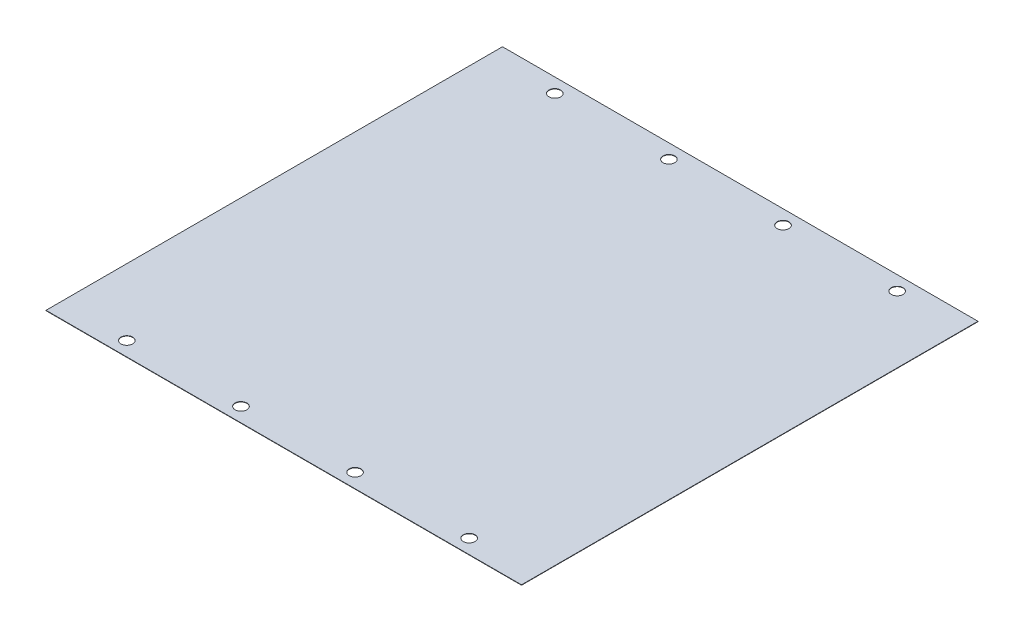
ISO-10303-21;
HEADER;
FILE_DESCRIPTION(('STEP AP214'),'2;1');
FILE_NAME('part.step','',(''),(''),'','','');
FILE_SCHEMA(('AUTOMOTIVE_DESIGN { 1 0 10303 214 1 1 1 1 }'));
ENDSEC;
DATA;
#1=APPLICATION_CONTEXT('core data for automotive mechanical design processes');
#2=APPLICATION_PROTOCOL_DEFINITION('international standard','automotive_design',2000,#1);
#3=PRODUCT_CONTEXT('',#1,'mechanical');
#4=PRODUCT('Part','Part','',(#3));
#5=PRODUCT_RELATED_PRODUCT_CATEGORY('part','',(#4));
#6=PRODUCT_DEFINITION_FORMATION('','',#4);
#7=PRODUCT_DEFINITION_CONTEXT('part definition',#1,'design');
#8=PRODUCT_DEFINITION('design','',#6,#7);
#9=PRODUCT_DEFINITION_SHAPE('','',#8);
#10=(LENGTH_UNIT() NAMED_UNIT(*) SI_UNIT(.MILLI.,.METRE.));
#11=(NAMED_UNIT(*) PLANE_ANGLE_UNIT() SI_UNIT($,.RADIAN.));
#12=(NAMED_UNIT(*) SI_UNIT($,.STERADIAN.) SOLID_ANGLE_UNIT());
#13=UNCERTAINTY_MEASURE_WITH_UNIT(LENGTH_MEASURE(1.E-05),#10,'distance_accuracy_value','');
#14=(GEOMETRIC_REPRESENTATION_CONTEXT(3) GLOBAL_UNCERTAINTY_ASSIGNED_CONTEXT((#13)) GLOBAL_UNIT_ASSIGNED_CONTEXT((#10,
#11,#12)) REPRESENTATION_CONTEXT('',''));
#15=CARTESIAN_POINT('',(0.,0.,0.));
#16=DIRECTION('',(0.,0.,1.));
#17=DIRECTION('',(1.,0.,0.));
#18=AXIS2_PLACEMENT_3D('',#15,#16,#17);
#19=CARTESIAN_POINT('',(0.,0.2,0.));
#20=DIRECTION('',(0.,1.,0.));
#21=DIRECTION('',(0.,0.,1.));
#22=AXIS2_PLACEMENT_3D('',#19,#20,#21);
#23=PLANE('',#22);
#24=CARTESIAN_POINT('',(-30.,0.2,112.5));
#25=DIRECTION('',(0.,1.,0.));
#26=DIRECTION('',(0.,0.,1.));
#27=AXIS2_PLACEMENT_3D('',#24,#25,#26);
#28=CIRCLE('',#27,3.1);
#29=CARTESIAN_POINT('',(-30.,0.2,115.6));
#30=VERTEX_POINT('',#29);
#31=EDGE_CURVE('E149',#30,#30,#28,.T.);
#32=ORIENTED_EDGE('',*,*,#31,.F.);
#33=EDGE_LOOP('',(#32));
#34=FACE_BOUND('',#33,.T.);
#35=CARTESIAN_POINT('',(90.,0.2,112.5));
#36=DIRECTION('',(0.,1.,0.));
#37=DIRECTION('',(0.,0.,1.));
#38=AXIS2_PLACEMENT_3D('',#35,#36,#37);
#39=CIRCLE('',#38,3.1);
#40=CARTESIAN_POINT('',(90.,0.2,115.6));
#41=VERTEX_POINT('',#40);
#42=EDGE_CURVE('E137',#41,#41,#39,.T.);
#43=ORIENTED_EDGE('',*,*,#42,.F.);
#44=EDGE_LOOP('',(#43));
#45=FACE_BOUND('',#44,.T.);
#46=CARTESIAN_POINT('',(30.,0.2,-112.5));
#47=DIRECTION('',(0.,1.,0.));
#48=DIRECTION('',(0.,0.,1.));
#49=AXIS2_PLACEMENT_3D('',#46,#47,#48);
#50=CIRCLE('',#49,3.1);
#51=CARTESIAN_POINT('',(30.,0.2,-109.4));
#52=VERTEX_POINT('',#51);
#53=EDGE_CURVE('E125',#52,#52,#50,.T.);
#54=ORIENTED_EDGE('',*,*,#53,.F.);
#55=EDGE_LOOP('',(#54));
#56=FACE_BOUND('',#55,.T.);
#57=CARTESIAN_POINT('',(-90.,0.2,-112.5));
#58=DIRECTION('',(0.,1.,0.));
#59=DIRECTION('',(0.,0.,1.));
#60=AXIS2_PLACEMENT_3D('',#57,#58,#59);
#61=CIRCLE('',#60,3.10000000000002);
#62=CARTESIAN_POINT('',(-90.,0.2,-109.4));
#63=VERTEX_POINT('',#62);
#64=EDGE_CURVE('E104',#63,#63,#61,.T.);
#65=ORIENTED_EDGE('',*,*,#64,.F.);
#66=EDGE_LOOP('',(#65));
#67=FACE_BOUND('',#66,.T.);
#68=DIRECTION('',(0.,0.,-1.));
#69=VECTOR('',#68,1.);
#70=CARTESIAN_POINT('',(125.,0.2,-120.));
#71=LINE('',#70,#69);
#72=CARTESIAN_POINT('',(125.,0.2,120.));
#73=VERTEX_POINT('',#72);
#74=CARTESIAN_POINT('',(125.,0.2,-120.));
#75=VERTEX_POINT('',#74);
#76=EDGE_CURVE('E89',#73,#75,#71,.T.);
#77=ORIENTED_EDGE('',*,*,#76,.T.);
#78=DIRECTION('',(-1.,0.,0.));
#79=VECTOR('',#78,1.);
#80=CARTESIAN_POINT('',(-125.,0.2,-120.));
#81=LINE('',#80,#79);
#82=CARTESIAN_POINT('',(-125.,0.2,-120.));
#83=VERTEX_POINT('',#82);
#84=EDGE_CURVE('E84',#75,#83,#81,.T.);
#85=ORIENTED_EDGE('',*,*,#84,.T.);
#86=DIRECTION('',(0.,0.,1.));
#87=VECTOR('',#86,1.);
#88=CARTESIAN_POINT('',(-125.,0.2,-120.));
#89=LINE('',#88,#87);
#90=CARTESIAN_POINT('',(-125.,0.2,120.));
#91=VERTEX_POINT('',#90);
#92=EDGE_CURVE('E87',#83,#91,#89,.T.);
#93=ORIENTED_EDGE('',*,*,#92,.T.);
#94=DIRECTION('',(1.,0.,0.));
#95=VECTOR('',#94,1.);
#96=CARTESIAN_POINT('',(-125.,0.2,120.));
#97=LINE('',#96,#95);
#98=EDGE_CURVE('E54',#91,#73,#97,.T.);
#99=ORIENTED_EDGE('',*,*,#98,.T.);
#100=EDGE_LOOP('',(#77,#85,#93,#99));
#101=FACE_BOUND('',#100,.T.);
#102=CARTESIAN_POINT('',(-30.,0.2,-112.5));
#103=DIRECTION('',(0.,1.,0.));
#104=DIRECTION('',(0.,0.,1.));
#105=AXIS2_PLACEMENT_3D('',#102,#103,#104);
#106=CIRCLE('',#105,3.10000000000001);
#107=CARTESIAN_POINT('',(-30.,0.2,-109.4));
#108=VERTEX_POINT('',#107);
#109=EDGE_CURVE('E119',#108,#108,#106,.T.);
#110=ORIENTED_EDGE('',*,*,#109,.F.);
#111=EDGE_LOOP('',(#110));
#112=FACE_BOUND('',#111,.T.);
#113=CARTESIAN_POINT('',(90.,0.2,-112.5));
#114=DIRECTION('',(0.,1.,0.));
#115=DIRECTION('',(0.,0.,1.));
#116=AXIS2_PLACEMENT_3D('',#113,#114,#115);
#117=CIRCLE('',#116,3.1);
#118=CARTESIAN_POINT('',(90.,0.2,-109.4));
#119=VERTEX_POINT('',#118);
#120=EDGE_CURVE('E131',#119,#119,#117,.T.);
#121=ORIENTED_EDGE('',*,*,#120,.F.);
#122=EDGE_LOOP('',(#121));
#123=FACE_BOUND('',#122,.T.);
#124=CARTESIAN_POINT('',(30.,0.2,112.5));
#125=DIRECTION('',(0.,1.,0.));
#126=DIRECTION('',(0.,0.,1.));
#127=AXIS2_PLACEMENT_3D('',#124,#125,#126);
#128=CIRCLE('',#127,3.1);
#129=CARTESIAN_POINT('',(30.,0.2,115.6));
#130=VERTEX_POINT('',#129);
#131=EDGE_CURVE('E143',#130,#130,#128,.T.);
#132=ORIENTED_EDGE('',*,*,#131,.F.);
#133=EDGE_LOOP('',(#132));
#134=FACE_BOUND('',#133,.T.);
#135=CARTESIAN_POINT('',(-90.,0.2,112.5));
#136=DIRECTION('',(0.,1.,0.));
#137=DIRECTION('',(0.,0.,1.));
#138=AXIS2_PLACEMENT_3D('',#135,#136,#137);
#139=CIRCLE('',#138,3.10000000000002);
#140=CARTESIAN_POINT('',(-90.,0.2,115.6));
#141=VERTEX_POINT('',#140);
#142=EDGE_CURVE('E155',#141,#141,#139,.T.);
#143=ORIENTED_EDGE('',*,*,#142,.F.);
#144=EDGE_LOOP('',(#143));
#145=FACE_BOUND('',#144,.T.);
#146=ADVANCED_FACE('F37',(#34,#45,#56,#67,#101,#112,#123,#134,#145),#23,.T.);
#147=CARTESIAN_POINT('',(0.,0.,0.));
#148=DIRECTION('',(0.,1.,0.));
#149=DIRECTION('',(0.,0.,1.));
#150=AXIS2_PLACEMENT_3D('',#147,#148,#149);
#151=PLANE('',#150);
#152=DIRECTION('',(0.,0.,-1.));
#153=VECTOR('',#152,1.);
#154=CARTESIAN_POINT('',(125.,0.,-120.));
#155=LINE('',#154,#153);
#156=CARTESIAN_POINT('',(125.,0.,120.));
#157=VERTEX_POINT('',#156);
#158=CARTESIAN_POINT('',(125.,0.,-120.));
#159=VERTEX_POINT('',#158);
#160=EDGE_CURVE('E101',#157,#159,#155,.T.);
#161=ORIENTED_EDGE('',*,*,#160,.F.);
#162=DIRECTION('',(1.,0.,0.));
#163=VECTOR('',#162,1.);
#164=CARTESIAN_POINT('',(-125.,0.,120.));
#165=LINE('',#164,#163);
#166=CARTESIAN_POINT('',(-125.,0.,120.));
#167=VERTEX_POINT('',#166);
#168=EDGE_CURVE('E77',#167,#157,#165,.T.);
#169=ORIENTED_EDGE('',*,*,#168,.F.);
#170=DIRECTION('',(0.,0.,1.));
#171=VECTOR('',#170,1.);
#172=CARTESIAN_POINT('',(-125.,0.,-120.));
#173=LINE('',#172,#171);
#174=CARTESIAN_POINT('',(-125.,0.,-120.));
#175=VERTEX_POINT('',#174);
#176=EDGE_CURVE('E71',#175,#167,#173,.T.);
#177=ORIENTED_EDGE('',*,*,#176,.F.);
#178=DIRECTION('',(-1.,0.,0.));
#179=VECTOR('',#178,1.);
#180=CARTESIAN_POINT('',(-125.,0.,-120.));
#181=LINE('',#180,#179);
#182=EDGE_CURVE('E93',#159,#175,#181,.T.);
#183=ORIENTED_EDGE('',*,*,#182,.F.);
#184=EDGE_LOOP('',(#161,#169,#177,#183));
#185=FACE_BOUND('',#184,.T.);
#186=CARTESIAN_POINT('',(-90.,0.,-112.5));
#187=DIRECTION('',(0.,1.,0.));
#188=DIRECTION('',(0.,0.,1.));
#189=AXIS2_PLACEMENT_3D('',#186,#187,#188);
#190=CIRCLE('',#189,3.10000000000002);
#191=CARTESIAN_POINT('',(-90.,0.,-109.4));
#192=VERTEX_POINT('',#191);
#193=EDGE_CURVE('E116',#192,#192,#190,.T.);
#194=ORIENTED_EDGE('',*,*,#193,.T.);
#195=EDGE_LOOP('',(#194));
#196=FACE_BOUND('',#195,.T.);
#197=CARTESIAN_POINT('',(-30.,0.,-112.5));
#198=DIRECTION('',(0.,1.,0.));
#199=DIRECTION('',(0.,0.,1.));
#200=AXIS2_PLACEMENT_3D('',#197,#198,#199);
#201=CIRCLE('',#200,3.10000000000001);
#202=CARTESIAN_POINT('',(-30.,0.,-109.4));
#203=VERTEX_POINT('',#202);
#204=EDGE_CURVE('E122',#203,#203,#201,.T.);
#205=ORIENTED_EDGE('',*,*,#204,.T.);
#206=EDGE_LOOP('',(#205));
#207=FACE_BOUND('',#206,.T.);
#208=CARTESIAN_POINT('',(30.,0.,-112.5));
#209=DIRECTION('',(0.,1.,0.));
#210=DIRECTION('',(0.,0.,1.));
#211=AXIS2_PLACEMENT_3D('',#208,#209,#210);
#212=CIRCLE('',#211,3.1);
#213=CARTESIAN_POINT('',(30.,0.,-109.4));
#214=VERTEX_POINT('',#213);
#215=EDGE_CURVE('E128',#214,#214,#212,.T.);
#216=ORIENTED_EDGE('',*,*,#215,.T.);
#217=EDGE_LOOP('',(#216));
#218=FACE_BOUND('',#217,.T.);
#219=CARTESIAN_POINT('',(90.,0.,-112.5));
#220=DIRECTION('',(0.,1.,0.));
#221=DIRECTION('',(0.,0.,1.));
#222=AXIS2_PLACEMENT_3D('',#219,#220,#221);
#223=CIRCLE('',#222,3.1);
#224=CARTESIAN_POINT('',(90.,0.,-109.4));
#225=VERTEX_POINT('',#224);
#226=EDGE_CURVE('E134',#225,#225,#223,.T.);
#227=ORIENTED_EDGE('',*,*,#226,.T.);
#228=EDGE_LOOP('',(#227));
#229=FACE_BOUND('',#228,.T.);
#230=CARTESIAN_POINT('',(90.,0.,112.5));
#231=DIRECTION('',(0.,1.,0.));
#232=DIRECTION('',(0.,0.,1.));
#233=AXIS2_PLACEMENT_3D('',#230,#231,#232);
#234=CIRCLE('',#233,3.1);
#235=CARTESIAN_POINT('',(90.,0.,115.6));
#236=VERTEX_POINT('',#235);
#237=EDGE_CURVE('E140',#236,#236,#234,.T.);
#238=ORIENTED_EDGE('',*,*,#237,.T.);
#239=EDGE_LOOP('',(#238));
#240=FACE_BOUND('',#239,.T.);
#241=CARTESIAN_POINT('',(30.,0.,112.5));
#242=DIRECTION('',(0.,1.,0.));
#243=DIRECTION('',(0.,0.,1.));
#244=AXIS2_PLACEMENT_3D('',#241,#242,#243);
#245=CIRCLE('',#244,3.1);
#246=CARTESIAN_POINT('',(30.,0.,115.6));
#247=VERTEX_POINT('',#246);
#248=EDGE_CURVE('E146',#247,#247,#245,.T.);
#249=ORIENTED_EDGE('',*,*,#248,.T.);
#250=EDGE_LOOP('',(#249));
#251=FACE_BOUND('',#250,.T.);
#252=CARTESIAN_POINT('',(-30.,0.,112.5));
#253=DIRECTION('',(0.,1.,0.));
#254=DIRECTION('',(0.,0.,1.));
#255=AXIS2_PLACEMENT_3D('',#252,#253,#254);
#256=CIRCLE('',#255,3.1);
#257=CARTESIAN_POINT('',(-30.,0.,115.6));
#258=VERTEX_POINT('',#257);
#259=EDGE_CURVE('E152',#258,#258,#256,.T.);
#260=ORIENTED_EDGE('',*,*,#259,.T.);
#261=EDGE_LOOP('',(#260));
#262=FACE_BOUND('',#261,.T.);
#263=CARTESIAN_POINT('',(-90.,0.,112.5));
#264=DIRECTION('',(0.,1.,0.));
#265=DIRECTION('',(0.,0.,1.));
#266=AXIS2_PLACEMENT_3D('',#263,#264,#265);
#267=CIRCLE('',#266,3.10000000000002);
#268=CARTESIAN_POINT('',(-90.,0.,115.6));
#269=VERTEX_POINT('',#268);
#270=EDGE_CURVE('E158',#269,#269,#267,.T.);
#271=ORIENTED_EDGE('',*,*,#270,.T.);
#272=EDGE_LOOP('',(#271));
#273=FACE_BOUND('',#272,.T.);
#274=ADVANCED_FACE('F112',(#185,#196,#207,#218,#229,#240,#251,#262,#273),#151,.F.);
#275=CARTESIAN_POINT('',(125.,0.2,-120.));
#276=DIRECTION('',(-1.,0.,0.));
#277=DIRECTION('',(0.,0.,1.));
#278=AXIS2_PLACEMENT_3D('',#275,#276,#277);
#279=PLANE('',#278);
#280=ORIENTED_EDGE('',*,*,#160,.T.);
#281=DIRECTION('',(0.,-1.,0.));
#282=VECTOR('',#281,1.);
#283=CARTESIAN_POINT('',(125.,0.2,-120.));
#284=LINE('',#283,#282);
#285=EDGE_CURVE('E11',#75,#159,#284,.T.);
#286=ORIENTED_EDGE('',*,*,#285,.F.);
#287=ORIENTED_EDGE('',*,*,#76,.F.);
#288=DIRECTION('',(0.,-1.,0.));
#289=VECTOR('',#288,1.);
#290=CARTESIAN_POINT('',(125.,0.2,120.));
#291=LINE('',#290,#289);
#292=EDGE_CURVE('E97',#73,#157,#291,.T.);
#293=ORIENTED_EDGE('',*,*,#292,.T.);
#294=EDGE_LOOP('',(#280,#286,#287,#293));
#295=FACE_BOUND('',#294,.T.);
#296=ADVANCED_FACE('F39',(#295),#279,.F.);
#297=CARTESIAN_POINT('',(-125.,0.2,-120.));
#298=DIRECTION('',(0.,0.,1.));
#299=DIRECTION('',(1.,0.,0.));
#300=AXIS2_PLACEMENT_3D('',#297,#298,#299);
#301=PLANE('',#300);
#302=ORIENTED_EDGE('',*,*,#182,.T.);
#303=DIRECTION('',(0.,-1.,0.));
#304=VECTOR('',#303,1.);
#305=CARTESIAN_POINT('',(-125.,0.2,-120.));
#306=LINE('',#305,#304);
#307=EDGE_CURVE('E46',#83,#175,#306,.T.);
#308=ORIENTED_EDGE('',*,*,#307,.F.);
#309=ORIENTED_EDGE('',*,*,#84,.F.);
#310=ORIENTED_EDGE('',*,*,#285,.T.);
#311=EDGE_LOOP('',(#302,#308,#309,#310));
#312=FACE_BOUND('',#311,.T.);
#313=ADVANCED_FACE('F92',(#312),#301,.F.);
#314=CARTESIAN_POINT('',(-125.,0.2,-120.));
#315=DIRECTION('',(1.,0.,0.));
#316=DIRECTION('',(0.,0.,-1.));
#317=AXIS2_PLACEMENT_3D('',#314,#315,#316);
#318=PLANE('',#317);
#319=ORIENTED_EDGE('',*,*,#176,.T.);
#320=DIRECTION('',(0.,-1.,0.));
#321=VECTOR('',#320,1.);
#322=CARTESIAN_POINT('',(-125.,0.2,120.));
#323=LINE('',#322,#321);
#324=EDGE_CURVE('E94',#91,#167,#323,.T.);
#325=ORIENTED_EDGE('',*,*,#324,.F.);
#326=ORIENTED_EDGE('',*,*,#92,.F.);
#327=ORIENTED_EDGE('',*,*,#307,.T.);
#328=EDGE_LOOP('',(#319,#325,#326,#327));
#329=FACE_BOUND('',#328,.T.);
#330=ADVANCED_FACE('F95',(#329),#318,.F.);
#331=CARTESIAN_POINT('',(-125.,0.2,120.));
#332=DIRECTION('',(0.,0.,-1.));
#333=DIRECTION('',(-1.,0.,0.));
#334=AXIS2_PLACEMENT_3D('',#331,#332,#333);
#335=PLANE('',#334);
#336=ORIENTED_EDGE('',*,*,#168,.T.);
#337=ORIENTED_EDGE('',*,*,#292,.F.);
#338=ORIENTED_EDGE('',*,*,#98,.F.);
#339=ORIENTED_EDGE('',*,*,#324,.T.);
#340=EDGE_LOOP('',(#336,#337,#338,#339));
#341=FACE_BOUND('',#340,.T.);
#342=ADVANCED_FACE('F109',(#341),#335,.F.);
#343=CARTESIAN_POINT('',(-90.,0.2,-112.5));
#344=DIRECTION('',(0.,-1.,0.));
#345=DIRECTION('',(0.,0.,-1.));
#346=AXIS2_PLACEMENT_3D('',#343,#344,#345);
#347=CYLINDRICAL_SURFACE('',#346,3.10000000000002);
#348=ORIENTED_EDGE('',*,*,#64,.T.);
#349=EDGE_LOOP('',(#348));
#350=FACE_BOUND('',#349,.T.);
#351=ORIENTED_EDGE('',*,*,#193,.F.);
#352=EDGE_LOOP('',(#351));
#353=FACE_BOUND('',#352,.T.);
#354=ADVANCED_FACE('F177',(#350,#353),#347,.F.);
#355=CARTESIAN_POINT('',(-30.,0.2,-112.5));
#356=DIRECTION('',(0.,-1.,0.));
#357=DIRECTION('',(0.,0.,-1.));
#358=AXIS2_PLACEMENT_3D('',#355,#356,#357);
#359=CYLINDRICAL_SURFACE('',#358,3.10000000000001);
#360=ORIENTED_EDGE('',*,*,#109,.T.);
#361=EDGE_LOOP('',(#360));
#362=FACE_BOUND('',#361,.T.);
#363=ORIENTED_EDGE('',*,*,#204,.F.);
#364=EDGE_LOOP('',(#363));
#365=FACE_BOUND('',#364,.T.);
#366=ADVANCED_FACE('F223',(#362,#365),#359,.F.);
#367=CARTESIAN_POINT('',(30.,0.2,-112.5));
#368=DIRECTION('',(0.,-1.,0.));
#369=DIRECTION('',(0.,0.,-1.));
#370=AXIS2_PLACEMENT_3D('',#367,#368,#369);
#371=CYLINDRICAL_SURFACE('',#370,3.1);
#372=ORIENTED_EDGE('',*,*,#53,.T.);
#373=EDGE_LOOP('',(#372));
#374=FACE_BOUND('',#373,.T.);
#375=ORIENTED_EDGE('',*,*,#215,.F.);
#376=EDGE_LOOP('',(#375));
#377=FACE_BOUND('',#376,.T.);
#378=ADVANCED_FACE('F231',(#374,#377),#371,.F.);
#379=CARTESIAN_POINT('',(90.,0.2,-112.5));
#380=DIRECTION('',(0.,-1.,0.));
#381=DIRECTION('',(0.,0.,-1.));
#382=AXIS2_PLACEMENT_3D('',#379,#380,#381);
#383=CYLINDRICAL_SURFACE('',#382,3.1);
#384=ORIENTED_EDGE('',*,*,#120,.T.);
#385=EDGE_LOOP('',(#384));
#386=FACE_BOUND('',#385,.T.);
#387=ORIENTED_EDGE('',*,*,#226,.F.);
#388=EDGE_LOOP('',(#387));
#389=FACE_BOUND('',#388,.T.);
#390=ADVANCED_FACE('F239',(#386,#389),#383,.F.);
#391=CARTESIAN_POINT('',(90.,0.2,112.5));
#392=DIRECTION('',(0.,-1.,0.));
#393=DIRECTION('',(0.,0.,-1.));
#394=AXIS2_PLACEMENT_3D('',#391,#392,#393);
#395=CYLINDRICAL_SURFACE('',#394,3.1);
#396=ORIENTED_EDGE('',*,*,#42,.T.);
#397=EDGE_LOOP('',(#396));
#398=FACE_BOUND('',#397,.T.);
#399=ORIENTED_EDGE('',*,*,#237,.F.);
#400=EDGE_LOOP('',(#399));
#401=FACE_BOUND('',#400,.T.);
#402=ADVANCED_FACE('F248',(#398,#401),#395,.F.);
#403=CARTESIAN_POINT('',(30.,0.2,112.5));
#404=DIRECTION('',(0.,-1.,0.));
#405=DIRECTION('',(0.,0.,-1.));
#406=AXIS2_PLACEMENT_3D('',#403,#404,#405);
#407=CYLINDRICAL_SURFACE('',#406,3.1);
#408=ORIENTED_EDGE('',*,*,#131,.T.);
#409=EDGE_LOOP('',(#408));
#410=FACE_BOUND('',#409,.T.);
#411=ORIENTED_EDGE('',*,*,#248,.F.);
#412=EDGE_LOOP('',(#411));
#413=FACE_BOUND('',#412,.T.);
#414=ADVANCED_FACE('F257',(#410,#413),#407,.F.);
#415=CARTESIAN_POINT('',(-30.,0.2,112.5));
#416=DIRECTION('',(0.,-1.,0.));
#417=DIRECTION('',(0.,0.,-1.));
#418=AXIS2_PLACEMENT_3D('',#415,#416,#417);
#419=CYLINDRICAL_SURFACE('',#418,3.1);
#420=ORIENTED_EDGE('',*,*,#31,.T.);
#421=EDGE_LOOP('',(#420));
#422=FACE_BOUND('',#421,.T.);
#423=ORIENTED_EDGE('',*,*,#259,.F.);
#424=EDGE_LOOP('',(#423));
#425=FACE_BOUND('',#424,.T.);
#426=ADVANCED_FACE('F266',(#422,#425),#419,.F.);
#427=CARTESIAN_POINT('',(-90.,0.2,112.5));
#428=DIRECTION('',(0.,-1.,0.));
#429=DIRECTION('',(0.,0.,-1.));
#430=AXIS2_PLACEMENT_3D('',#427,#428,#429);
#431=CYLINDRICAL_SURFACE('',#430,3.10000000000002);
#432=ORIENTED_EDGE('',*,*,#142,.T.);
#433=EDGE_LOOP('',(#432));
#434=FACE_BOUND('',#433,.T.);
#435=ORIENTED_EDGE('',*,*,#270,.F.);
#436=EDGE_LOOP('',(#435));
#437=FACE_BOUND('',#436,.T.);
#438=ADVANCED_FACE('F164',(#434,#437),#431,.F.);
#439=CLOSED_SHELL('',(#146,#274,#296,#313,#330,#342,#354,#366,#378,#390,#402,#414,#426,#438));
#440=MANIFOLD_SOLID_BREP('B2',#439);
#441=ADVANCED_BREP_SHAPE_REPRESENTATION('',(#18,#440),#14);
#442=SHAPE_DEFINITION_REPRESENTATION(#9,#441);
ENDSEC;
END-ISO-10303-21;
